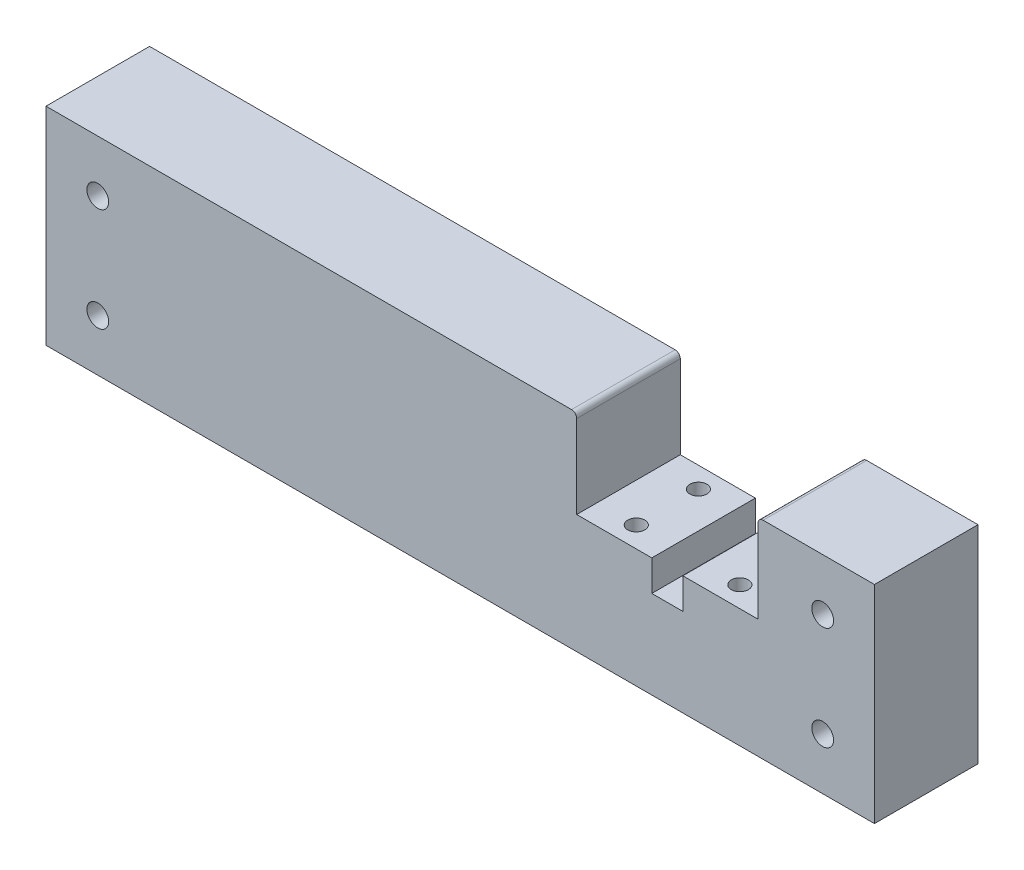
ISO-10303-21;
HEADER;
FILE_DESCRIPTION(('STEP AP214'),'2;1');
FILE_NAME('part.step','',(''),(''),'','','');
FILE_SCHEMA(('AUTOMOTIVE_DESIGN { 1 0 10303 214 1 1 1 1 }'));
ENDSEC;
DATA;
#1=APPLICATION_CONTEXT('core data for automotive mechanical design processes');
#2=APPLICATION_PROTOCOL_DEFINITION('international standard','automotive_design',2000,#1);
#3=PRODUCT_CONTEXT('',#1,'mechanical');
#4=PRODUCT('Part','Part','',(#3));
#5=PRODUCT_RELATED_PRODUCT_CATEGORY('part','',(#4));
#6=PRODUCT_DEFINITION_FORMATION('','',#4);
#7=PRODUCT_DEFINITION_CONTEXT('part definition',#1,'design');
#8=PRODUCT_DEFINITION('design','',#6,#7);
#9=PRODUCT_DEFINITION_SHAPE('','',#8);
#10=(LENGTH_UNIT() NAMED_UNIT(*) SI_UNIT(.MILLI.,.METRE.));
#11=(NAMED_UNIT(*) PLANE_ANGLE_UNIT() SI_UNIT($,.RADIAN.));
#12=(NAMED_UNIT(*) SI_UNIT($,.STERADIAN.) SOLID_ANGLE_UNIT());
#13=UNCERTAINTY_MEASURE_WITH_UNIT(LENGTH_MEASURE(1.E-05),#10,'distance_accuracy_value','');
#14=(GEOMETRIC_REPRESENTATION_CONTEXT(3) GLOBAL_UNCERTAINTY_ASSIGNED_CONTEXT((#13)) GLOBAL_UNIT_ASSIGNED_CONTEXT((#10,
#11,#12)) REPRESENTATION_CONTEXT('',''));
#15=CARTESIAN_POINT('',(0.,0.,0.));
#16=DIRECTION('',(0.,0.,1.));
#17=DIRECTION('',(1.,0.,0.));
#18=AXIS2_PLACEMENT_3D('',#15,#16,#17);
#19=CARTESIAN_POINT('',(57.5,0.,-20.));
#20=DIRECTION('',(1.,0.,0.));
#21=DIRECTION('',(0.,0.,-1.));
#22=AXIS2_PLACEMENT_3D('',#19,#20,#21);
#23=PLANE('',#22);
#24=DIRECTION('',(0.,1.,0.));
#25=VECTOR('',#24,1.);
#26=CARTESIAN_POINT('',(57.5,0.,0.));
#27=LINE('',#26,#25);
#28=CARTESIAN_POINT('',(57.5,22.95,0.));
#29=VERTEX_POINT('',#28);
#30=CARTESIAN_POINT('',(57.5,39.,0.));
#31=VERTEX_POINT('',#30);
#32=EDGE_CURVE('E236',#29,#31,#27,.T.);
#33=ORIENTED_EDGE('',*,*,#32,.T.);
#34=DIRECTION('',(0.,0.,1.));
#35=VECTOR('',#34,1.);
#36=CARTESIAN_POINT('',(57.5,39.,-20.));
#37=LINE('',#36,#35);
#38=CARTESIAN_POINT('',(57.5,39.,-20.));
#39=VERTEX_POINT('',#38);
#40=EDGE_CURVE('E323',#31,#39,#37,.F.);
#41=ORIENTED_EDGE('',*,*,#40,.T.);
#42=DIRECTION('',(0.,1.,0.));
#43=VECTOR('',#42,1.);
#44=CARTESIAN_POINT('',(57.5,0.,-20.));
#45=LINE('',#44,#43);
#46=CARTESIAN_POINT('',(57.5,22.95,-20.));
#47=VERTEX_POINT('',#46);
#48=EDGE_CURVE('E237',#47,#39,#45,.T.);
#49=ORIENTED_EDGE('',*,*,#48,.F.);
#50=DIRECTION('',(0.,0.,1.));
#51=VECTOR('',#50,1.);
#52=CARTESIAN_POINT('',(57.5,22.95,-20.));
#53=LINE('',#52,#51);
#54=EDGE_CURVE('E314',#47,#29,#53,.T.);
#55=ORIENTED_EDGE('',*,*,#54,.T.);
#56=EDGE_LOOP('',(#33,#41,#49,#55));
#57=FACE_BOUND('',#56,.T.);
#58=ADVANCED_FACE('F41',(#57),#23,.F.);
#59=CARTESIAN_POINT('',(0.,40.,-20.));
#60=DIRECTION('',(0.,-1.,0.));
#61=DIRECTION('',(0.,0.,-1.));
#62=AXIS2_PLACEMENT_3D('',#59,#60,#61);
#63=PLANE('',#62);
#64=DIRECTION('',(1.,0.,0.));
#65=VECTOR('',#64,1.);
#66=CARTESIAN_POINT('',(0.,40.,-20.));
#67=LINE('',#66,#65);
#68=CARTESIAN_POINT('',(58.5,40.,-20.));
#69=VERTEX_POINT('',#68);
#70=CARTESIAN_POINT('',(80.,40.,-20.));
#71=VERTEX_POINT('',#70);
#72=EDGE_CURVE('E256',#69,#71,#67,.T.);
#73=ORIENTED_EDGE('',*,*,#72,.F.);
#74=DIRECTION('',(0.,0.,1.));
#75=VECTOR('',#74,1.);
#76=CARTESIAN_POINT('',(58.5,40.,-20.));
#77=LINE('',#76,#75);
#78=CARTESIAN_POINT('',(58.5,40.,0.));
#79=VERTEX_POINT('',#78);
#80=EDGE_CURVE('E292',#69,#79,#77,.T.);
#81=ORIENTED_EDGE('',*,*,#80,.T.);
#82=DIRECTION('',(1.,0.,0.));
#83=VECTOR('',#82,1.);
#84=CARTESIAN_POINT('',(0.,40.,0.));
#85=LINE('',#84,#83);
#86=CARTESIAN_POINT('',(80.,40.,0.));
#87=VERTEX_POINT('',#86);
#88=EDGE_CURVE('E241',#79,#87,#85,.T.);
#89=ORIENTED_EDGE('',*,*,#88,.T.);
#90=DIRECTION('',(0.,0.,1.));
#91=VECTOR('',#90,1.);
#92=CARTESIAN_POINT('',(80.,40.,-20.));
#93=LINE('',#92,#91);
#94=EDGE_CURVE('E289',#71,#87,#93,.T.);
#95=ORIENTED_EDGE('',*,*,#94,.F.);
#96=EDGE_LOOP('',(#73,#81,#89,#95));
#97=FACE_BOUND('',#96,.T.);
#98=ADVANCED_FACE('F373',(#97),#63,.F.);
#99=CARTESIAN_POINT('',(80.,0.,-20.));
#100=DIRECTION('',(-1.,0.,0.));
#101=DIRECTION('',(0.,0.,1.));
#102=AXIS2_PLACEMENT_3D('',#99,#100,#101);
#103=PLANE('',#102);
#104=DIRECTION('',(0.,-1.,0.));
#105=VECTOR('',#104,1.);
#106=CARTESIAN_POINT('',(80.,0.,0.));
#107=LINE('',#106,#105);
#108=CARTESIAN_POINT('',(80.,0.,0.));
#109=VERTEX_POINT('',#108);
#110=EDGE_CURVE('E286',#87,#109,#107,.T.);
#111=ORIENTED_EDGE('',*,*,#110,.T.);
#112=DIRECTION('',(0.,0.,1.));
#113=VECTOR('',#112,1.);
#114=CARTESIAN_POINT('',(80.,0.,-20.));
#115=LINE('',#114,#113);
#116=CARTESIAN_POINT('',(80.,0.,-20.));
#117=VERTEX_POINT('',#116);
#118=EDGE_CURVE('E293',#117,#109,#115,.T.);
#119=ORIENTED_EDGE('',*,*,#118,.F.);
#120=DIRECTION('',(0.,-1.,0.));
#121=VECTOR('',#120,1.);
#122=CARTESIAN_POINT('',(80.,0.,-20.));
#123=LINE('',#122,#121);
#124=EDGE_CURVE('E262',#71,#117,#123,.T.);
#125=ORIENTED_EDGE('',*,*,#124,.F.);
#126=ORIENTED_EDGE('',*,*,#94,.T.);
#127=EDGE_LOOP('',(#111,#119,#125,#126));
#128=FACE_BOUND('',#127,.T.);
#129=ADVANCED_FACE('F380',(#128),#103,.F.);
#130=CARTESIAN_POINT('',(0.,0.,-20.));
#131=DIRECTION('',(0.,-1.,0.));
#132=DIRECTION('',(1.,0.,0.));
#133=AXIS2_PLACEMENT_3D('',#130,#131,#132);
#134=PLANE('',#133);
#135=CARTESIAN_POINT('',(-60.,0.,-10.));
#136=DIRECTION('',(0.,-1.,0.));
#137=DIRECTION('',(0.,0.,-1.));
#138=AXIS2_PLACEMENT_3D('',#135,#136,#137);
#139=CIRCLE('',#138,2.09999999999999);
#140=CARTESIAN_POINT('',(-60.,0.,-12.1));
#141=VERTEX_POINT('',#140);
#142=EDGE_CURVE('E172',#141,#141,#139,.T.);
#143=ORIENTED_EDGE('',*,*,#142,.F.);
#144=EDGE_LOOP('',(#143));
#145=FACE_BOUND('',#144,.T.);
#146=CARTESIAN_POINT('',(0.,0.,-10.));
#147=DIRECTION('',(0.,-1.,0.));
#148=DIRECTION('',(0.,0.,-1.));
#149=AXIS2_PLACEMENT_3D('',#146,#147,#148);
#150=CIRCLE('',#149,2.09999999999999);
#151=CARTESIAN_POINT('',(0.,0.,-12.1));
#152=VERTEX_POINT('',#151);
#153=EDGE_CURVE('E171',#152,#152,#150,.T.);
#154=ORIENTED_EDGE('',*,*,#153,.F.);
#155=EDGE_LOOP('',(#154));
#156=FACE_BOUND('',#155,.T.);
#157=CARTESIAN_POINT('',(60.,0.,-10.));
#158=DIRECTION('',(0.,-1.,0.));
#159=DIRECTION('',(0.,0.,-1.));
#160=AXIS2_PLACEMENT_3D('',#157,#158,#159);
#161=CIRCLE('',#160,2.09999999999999);
#162=CARTESIAN_POINT('',(60.,0.,-12.1));
#163=VERTEX_POINT('',#162);
#164=EDGE_CURVE('E182',#163,#163,#161,.T.);
#165=ORIENTED_EDGE('',*,*,#164,.F.);
#166=EDGE_LOOP('',(#165));
#167=FACE_BOUND('',#166,.T.);
#168=DIRECTION('',(1.,0.,0.));
#169=VECTOR('',#168,1.);
#170=CARTESIAN_POINT('',(0.,0.,0.));
#171=LINE('',#170,#169);
#172=CARTESIAN_POINT('',(-80.,0.,0.));
#173=VERTEX_POINT('',#172);
#174=EDGE_CURVE('E283',#173,#109,#171,.T.);
#175=ORIENTED_EDGE('',*,*,#174,.F.);
#176=DIRECTION('',(0.,0.,1.));
#177=VECTOR('',#176,1.);
#178=CARTESIAN_POINT('',(-80.,0.,-20.));
#179=LINE('',#178,#177);
#180=CARTESIAN_POINT('',(-80.,0.,-20.));
#181=VERTEX_POINT('',#180);
#182=EDGE_CURVE('E295',#181,#173,#179,.T.);
#183=ORIENTED_EDGE('',*,*,#182,.F.);
#184=DIRECTION('',(1.,0.,0.));
#185=VECTOR('',#184,1.);
#186=CARTESIAN_POINT('',(0.,0.,-20.));
#187=LINE('',#186,#185);
#188=EDGE_CURVE('E259',#181,#117,#187,.T.);
#189=ORIENTED_EDGE('',*,*,#188,.T.);
#190=ORIENTED_EDGE('',*,*,#118,.T.);
#191=EDGE_LOOP('',(#175,#183,#189,#190));
#192=FACE_BOUND('',#191,.T.);
#193=ADVANCED_FACE('F416',(#145,#156,#167,#192),#134,.T.);
#194=CARTESIAN_POINT('',(-80.,0.,-20.));
#195=DIRECTION('',(-1.,0.,0.));
#196=DIRECTION('',(0.,0.,1.));
#197=AXIS2_PLACEMENT_3D('',#194,#195,#196);
#198=PLANE('',#197);
#199=DIRECTION('',(0.,-1.,0.));
#200=VECTOR('',#199,1.);
#201=CARTESIAN_POINT('',(-80.,0.,0.));
#202=LINE('',#201,#200);
#203=CARTESIAN_POINT('',(-80.,40.,0.));
#204=VERTEX_POINT('',#203);
#205=EDGE_CURVE('E280',#204,#173,#202,.T.);
#206=ORIENTED_EDGE('',*,*,#205,.F.);
#207=DIRECTION('',(0.,0.,1.));
#208=VECTOR('',#207,1.);
#209=CARTESIAN_POINT('',(-80.,40.,-20.));
#210=LINE('',#209,#208);
#211=CARTESIAN_POINT('',(-80.,40.,-20.));
#212=VERTEX_POINT('',#211);
#213=EDGE_CURVE('E297',#212,#204,#210,.T.);
#214=ORIENTED_EDGE('',*,*,#213,.F.);
#215=DIRECTION('',(0.,-1.,0.));
#216=VECTOR('',#215,1.);
#217=CARTESIAN_POINT('',(-80.,0.,-20.));
#218=LINE('',#217,#216);
#219=EDGE_CURVE('E255',#212,#181,#218,.T.);
#220=ORIENTED_EDGE('',*,*,#219,.T.);
#221=ORIENTED_EDGE('',*,*,#182,.T.);
#222=EDGE_LOOP('',(#206,#214,#220,#221));
#223=FACE_BOUND('',#222,.T.);
#224=ADVANCED_FACE('F387',(#223),#198,.T.);
#225=CARTESIAN_POINT('',(21.5,40.,0.));
#226=VERTEX_POINT('',#225);
#227=EDGE_CURVE('E278',#204,#226,#85,.T.);
#228=ORIENTED_EDGE('',*,*,#227,.T.);
#229=DIRECTION('',(0.,0.,1.));
#230=VECTOR('',#229,1.);
#231=CARTESIAN_POINT('',(21.5,40.,-20.));
#232=LINE('',#231,#230);
#233=CARTESIAN_POINT('',(21.5,40.,-20.));
#234=VERTEX_POINT('',#233);
#235=EDGE_CURVE('E11',#226,#234,#232,.F.);
#236=ORIENTED_EDGE('',*,*,#235,.T.);
#237=EDGE_CURVE('E253',#212,#234,#67,.T.);
#238=ORIENTED_EDGE('',*,*,#237,.F.);
#239=ORIENTED_EDGE('',*,*,#213,.T.);
#240=EDGE_LOOP('',(#228,#236,#238,#239));
#241=FACE_BOUND('',#240,.T.);
#242=ADVANCED_FACE('F388',(#241),#63,.F.);
#243=CARTESIAN_POINT('',(22.5,0.,-20.));
#244=DIRECTION('',(-1.,0.,0.));
#245=DIRECTION('',(0.,0.,1.));
#246=AXIS2_PLACEMENT_3D('',#243,#244,#245);
#247=PLANE('',#246);
#248=DIRECTION('',(0.,-1.,0.));
#249=VECTOR('',#248,1.);
#250=CARTESIAN_POINT('',(22.5,0.,-20.));
#251=LINE('',#250,#249);
#252=CARTESIAN_POINT('',(22.5,39.,-20.));
#253=VERTEX_POINT('',#252);
#254=CARTESIAN_POINT('',(22.5,22.95,-20.));
#255=VERTEX_POINT('',#254);
#256=EDGE_CURVE('E251',#253,#255,#251,.T.);
#257=ORIENTED_EDGE('',*,*,#256,.F.);
#258=DIRECTION('',(0.,0.,1.));
#259=VECTOR('',#258,1.);
#260=CARTESIAN_POINT('',(22.5,39.,-20.));
#261=LINE('',#260,#259);
#262=CARTESIAN_POINT('',(22.5,39.,0.));
#263=VERTEX_POINT('',#262);
#264=EDGE_CURVE('E49',#253,#263,#261,.T.);
#265=ORIENTED_EDGE('',*,*,#264,.T.);
#266=DIRECTION('',(0.,-1.,0.));
#267=VECTOR('',#266,1.);
#268=CARTESIAN_POINT('',(22.5,0.,0.));
#269=LINE('',#268,#267);
#270=CARTESIAN_POINT('',(22.5,22.95,0.));
#271=VERTEX_POINT('',#270);
#272=EDGE_CURVE('E276',#263,#271,#269,.T.);
#273=ORIENTED_EDGE('',*,*,#272,.T.);
#274=DIRECTION('',(0.,0.,1.));
#275=VECTOR('',#274,1.);
#276=CARTESIAN_POINT('',(22.5,22.95,-20.));
#277=LINE('',#276,#275);
#278=EDGE_CURVE('E299',#255,#271,#277,.T.);
#279=ORIENTED_EDGE('',*,*,#278,.F.);
#280=EDGE_LOOP('',(#257,#265,#273,#279));
#281=FACE_BOUND('',#280,.T.);
#282=ADVANCED_FACE('F331',(#281),#247,.F.);
#283=CARTESIAN_POINT('',(0.,22.95,-20.));
#284=DIRECTION('',(0.,-1.,0.));
#285=DIRECTION('',(0.,0.,-1.));
#286=AXIS2_PLACEMENT_3D('',#283,#284,#285);
#287=PLANE('',#286);
#288=CARTESIAN_POINT('',(30.,22.95,-4.));
#289=DIRECTION('',(0.,1.,0.));
#290=DIRECTION('',(0.,0.,1.));
#291=AXIS2_PLACEMENT_3D('',#288,#289,#290);
#292=CIRCLE('',#291,1.64999999999999);
#293=CARTESIAN_POINT('',(30.,22.95,-2.35000000000001));
#294=VERTEX_POINT('',#293);
#295=EDGE_CURVE('E212',#294,#294,#292,.T.);
#296=ORIENTED_EDGE('',*,*,#295,.F.);
#297=EDGE_LOOP('',(#296));
#298=FACE_BOUND('',#297,.T.);
#299=CARTESIAN_POINT('',(30.,22.95,-16.));
#300=DIRECTION('',(0.,1.,0.));
#301=DIRECTION('',(0.,0.,1.));
#302=AXIS2_PLACEMENT_3D('',#299,#300,#301);
#303=CIRCLE('',#302,1.64999999999999);
#304=CARTESIAN_POINT('',(30.,22.95,-14.35));
#305=VERTEX_POINT('',#304);
#306=EDGE_CURVE('E224',#305,#305,#303,.T.);
#307=ORIENTED_EDGE('',*,*,#306,.F.);
#308=EDGE_LOOP('',(#307));
#309=FACE_BOUND('',#308,.T.);
#310=DIRECTION('',(1.,0.,0.));
#311=VECTOR('',#310,1.);
#312=CARTESIAN_POINT('',(0.,22.95,0.));
#313=LINE('',#312,#311);
#314=CARTESIAN_POINT('',(37.,22.95,0.));
#315=VERTEX_POINT('',#314);
#316=EDGE_CURVE('E274',#271,#315,#313,.T.);
#317=ORIENTED_EDGE('',*,*,#316,.T.);
#318=DIRECTION('',(0.,0.,1.));
#319=VECTOR('',#318,1.);
#320=CARTESIAN_POINT('',(37.,22.95,-20.));
#321=LINE('',#320,#319);
#322=CARTESIAN_POINT('',(37.,22.95,-20.));
#323=VERTEX_POINT('',#322);
#324=EDGE_CURVE('E302',#323,#315,#321,.T.);
#325=ORIENTED_EDGE('',*,*,#324,.F.);
#326=DIRECTION('',(1.,0.,0.));
#327=VECTOR('',#326,1.);
#328=CARTESIAN_POINT('',(0.,22.95,-20.));
#329=LINE('',#328,#327);
#330=EDGE_CURVE('E249',#255,#323,#329,.T.);
#331=ORIENTED_EDGE('',*,*,#330,.F.);
#332=ORIENTED_EDGE('',*,*,#278,.T.);
#333=EDGE_LOOP('',(#317,#325,#331,#332));
#334=FACE_BOUND('',#333,.T.);
#335=ADVANCED_FACE('F343',(#298,#309,#334),#287,.F.);
#336=CARTESIAN_POINT('',(37.,0.,-20.));
#337=DIRECTION('',(-1.,0.,0.));
#338=DIRECTION('',(0.,0.,1.));
#339=AXIS2_PLACEMENT_3D('',#336,#337,#338);
#340=PLANE('',#339);
#341=DIRECTION('',(0.,-1.,0.));
#342=VECTOR('',#341,1.);
#343=CARTESIAN_POINT('',(37.,0.,0.));
#344=LINE('',#343,#342);
#345=CARTESIAN_POINT('',(37.,17.,0.));
#346=VERTEX_POINT('',#345);
#347=EDGE_CURVE('E272',#315,#346,#344,.T.);
#348=ORIENTED_EDGE('',*,*,#347,.T.);
#349=DIRECTION('',(0.,0.,1.));
#350=VECTOR('',#349,1.);
#351=CARTESIAN_POINT('',(37.,17.,-20.));
#352=LINE('',#351,#350);
#353=CARTESIAN_POINT('',(37.,17.,-20.));
#354=VERTEX_POINT('',#353);
#355=EDGE_CURVE('E305',#354,#346,#352,.T.);
#356=ORIENTED_EDGE('',*,*,#355,.F.);
#357=DIRECTION('',(0.,-1.,0.));
#358=VECTOR('',#357,1.);
#359=CARTESIAN_POINT('',(37.,0.,-20.));
#360=LINE('',#359,#358);
#361=EDGE_CURVE('E247',#323,#354,#360,.T.);
#362=ORIENTED_EDGE('',*,*,#361,.F.);
#363=ORIENTED_EDGE('',*,*,#324,.T.);
#364=EDGE_LOOP('',(#348,#356,#362,#363));
#365=FACE_BOUND('',#364,.T.);
#366=ADVANCED_FACE('F347',(#365),#340,.F.);
#367=CARTESIAN_POINT('',(0.,17.,-20.));
#368=DIRECTION('',(0.,-1.,0.));
#369=DIRECTION('',(0.,0.,-1.));
#370=AXIS2_PLACEMENT_3D('',#367,#368,#369);
#371=PLANE('',#370);
#372=DIRECTION('',(1.,0.,0.));
#373=VECTOR('',#372,1.);
#374=CARTESIAN_POINT('',(0.,17.,0.));
#375=LINE('',#374,#373);
#376=CARTESIAN_POINT('',(43.,17.,0.));
#377=VERTEX_POINT('',#376);
#378=EDGE_CURVE('E270',#346,#377,#375,.T.);
#379=ORIENTED_EDGE('',*,*,#378,.T.);
#380=DIRECTION('',(0.,0.,1.));
#381=VECTOR('',#380,1.);
#382=CARTESIAN_POINT('',(43.,17.,-20.));
#383=LINE('',#382,#381);
#384=CARTESIAN_POINT('',(43.,17.,-20.));
#385=VERTEX_POINT('',#384);
#386=EDGE_CURVE('E308',#385,#377,#383,.T.);
#387=ORIENTED_EDGE('',*,*,#386,.F.);
#388=DIRECTION('',(1.,0.,0.));
#389=VECTOR('',#388,1.);
#390=CARTESIAN_POINT('',(0.,17.,-20.));
#391=LINE('',#390,#389);
#392=EDGE_CURVE('E245',#354,#385,#391,.T.);
#393=ORIENTED_EDGE('',*,*,#392,.F.);
#394=ORIENTED_EDGE('',*,*,#355,.T.);
#395=EDGE_LOOP('',(#379,#387,#393,#394));
#396=FACE_BOUND('',#395,.T.);
#397=ADVANCED_FACE('F355',(#396),#371,.F.);
#398=CARTESIAN_POINT('',(43.,0.,-20.));
#399=DIRECTION('',(1.,0.,0.));
#400=DIRECTION('',(0.,0.,-1.));
#401=AXIS2_PLACEMENT_3D('',#398,#399,#400);
#402=PLANE('',#401);
#403=DIRECTION('',(0.,1.,0.));
#404=VECTOR('',#403,1.);
#405=CARTESIAN_POINT('',(43.,0.,0.));
#406=LINE('',#405,#404);
#407=CARTESIAN_POINT('',(43.,22.95,0.));
#408=VERTEX_POINT('',#407);
#409=EDGE_CURVE('E268',#377,#408,#406,.T.);
#410=ORIENTED_EDGE('',*,*,#409,.T.);
#411=DIRECTION('',(0.,0.,1.));
#412=VECTOR('',#411,1.);
#413=CARTESIAN_POINT('',(43.,22.95,-20.));
#414=LINE('',#413,#412);
#415=CARTESIAN_POINT('',(43.,22.95,-20.));
#416=VERTEX_POINT('',#415);
#417=EDGE_CURVE('E311',#416,#408,#414,.T.);
#418=ORIENTED_EDGE('',*,*,#417,.F.);
#419=DIRECTION('',(0.,1.,0.));
#420=VECTOR('',#419,1.);
#421=CARTESIAN_POINT('',(43.,0.,-20.));
#422=LINE('',#421,#420);
#423=EDGE_CURVE('E243',#385,#416,#422,.T.);
#424=ORIENTED_EDGE('',*,*,#423,.F.);
#425=ORIENTED_EDGE('',*,*,#386,.T.);
#426=EDGE_LOOP('',(#410,#418,#424,#425));
#427=FACE_BOUND('',#426,.T.);
#428=ADVANCED_FACE('F358',(#427),#402,.F.);
#429=CARTESIAN_POINT('',(0.,22.95,-20.));
#430=DIRECTION('',(0.,-1.,0.));
#431=DIRECTION('',(0.,0.,-1.));
#432=AXIS2_PLACEMENT_3D('',#429,#430,#431);
#433=PLANE('',#432);
#434=CARTESIAN_POINT('',(50.,22.95,-4.));
#435=DIRECTION('',(0.,1.,0.));
#436=DIRECTION('',(0.,0.,1.));
#437=AXIS2_PLACEMENT_3D('',#434,#435,#436);
#438=CIRCLE('',#437,1.64999999999999);
#439=CARTESIAN_POINT('',(50.,22.95,-2.35000000000001));
#440=VERTEX_POINT('',#439);
#441=EDGE_CURVE('E218',#440,#440,#438,.T.);
#442=ORIENTED_EDGE('',*,*,#441,.F.);
#443=EDGE_LOOP('',(#442));
#444=FACE_BOUND('',#443,.T.);
#445=CARTESIAN_POINT('',(50.,22.95,-16.));
#446=DIRECTION('',(0.,1.,0.));
#447=DIRECTION('',(0.,0.,1.));
#448=AXIS2_PLACEMENT_3D('',#445,#446,#447);
#449=CIRCLE('',#448,1.64999999999999);
#450=CARTESIAN_POINT('',(50.,22.95,-14.35));
#451=VERTEX_POINT('',#450);
#452=EDGE_CURVE('E230',#451,#451,#449,.T.);
#453=ORIENTED_EDGE('',*,*,#452,.F.);
#454=EDGE_LOOP('',(#453));
#455=FACE_BOUND('',#454,.T.);
#456=DIRECTION('',(1.,0.,0.));
#457=VECTOR('',#456,1.);
#458=CARTESIAN_POINT('',(0.,22.95,0.));
#459=LINE('',#458,#457);
#460=EDGE_CURVE('E266',#408,#29,#459,.T.);
#461=ORIENTED_EDGE('',*,*,#460,.T.);
#462=ORIENTED_EDGE('',*,*,#54,.F.);
#463=DIRECTION('',(1.,0.,0.));
#464=VECTOR('',#463,1.);
#465=CARTESIAN_POINT('',(0.,22.95,-20.));
#466=LINE('',#465,#464);
#467=EDGE_CURVE('E240',#416,#47,#466,.T.);
#468=ORIENTED_EDGE('',*,*,#467,.F.);
#469=ORIENTED_EDGE('',*,*,#417,.T.);
#470=EDGE_LOOP('',(#461,#462,#468,#469));
#471=FACE_BOUND('',#470,.T.);
#472=ADVANCED_FACE('F363',(#444,#455,#471),#433,.F.);
#473=CARTESIAN_POINT('',(0.,0.,-20.));
#474=DIRECTION('',(0.,0.,1.));
#475=DIRECTION('',(1.,0.,0.));
#476=AXIS2_PLACEMENT_3D('',#473,#474,#475);
#477=PLANE('',#476);
#478=CARTESIAN_POINT('',(-70.,30.,-20.));
#479=DIRECTION('',(0.,0.,1.));
#480=DIRECTION('',(1.,0.,0.));
#481=AXIS2_PLACEMENT_3D('',#478,#479,#480);
#482=CIRCLE('',#481,2.09999999999999);
#483=CARTESIAN_POINT('',(-67.9,30.,-20.));
#484=VERTEX_POINT('',#483);
#485=EDGE_CURVE('E191',#484,#484,#482,.T.);
#486=ORIENTED_EDGE('',*,*,#485,.T.);
#487=EDGE_LOOP('',(#486));
#488=FACE_BOUND('',#487,.T.);
#489=CARTESIAN_POINT('',(-70.,10.,-20.));
#490=DIRECTION('',(0.,0.,1.));
#491=DIRECTION('',(1.,0.,0.));
#492=AXIS2_PLACEMENT_3D('',#489,#490,#491);
#493=CIRCLE('',#492,2.09999999999999);
#494=CARTESIAN_POINT('',(-67.9,10.,-20.));
#495=VERTEX_POINT('',#494);
#496=EDGE_CURVE('E197',#495,#495,#493,.T.);
#497=ORIENTED_EDGE('',*,*,#496,.T.);
#498=EDGE_LOOP('',(#497));
#499=FACE_BOUND('',#498,.T.);
#500=CARTESIAN_POINT('',(70.,10.,-20.));
#501=DIRECTION('',(0.,0.,1.));
#502=DIRECTION('',(1.,0.,0.));
#503=AXIS2_PLACEMENT_3D('',#500,#501,#502);
#504=CIRCLE('',#503,2.09999999999999);
#505=CARTESIAN_POINT('',(72.1,10.,-20.));
#506=VERTEX_POINT('',#505);
#507=EDGE_CURVE('E203',#506,#506,#504,.T.);
#508=ORIENTED_EDGE('',*,*,#507,.T.);
#509=EDGE_LOOP('',(#508));
#510=FACE_BOUND('',#509,.T.);
#511=CARTESIAN_POINT('',(70.,30.,-20.));
#512=DIRECTION('',(0.,0.,1.));
#513=DIRECTION('',(1.,0.,0.));
#514=AXIS2_PLACEMENT_3D('',#511,#512,#513);
#515=CIRCLE('',#514,2.09999999999999);
#516=CARTESIAN_POINT('',(72.1,30.,-20.));
#517=VERTEX_POINT('',#516);
#518=EDGE_CURVE('E209',#517,#517,#515,.T.);
#519=ORIENTED_EDGE('',*,*,#518,.T.);
#520=EDGE_LOOP('',(#519));
#521=FACE_BOUND('',#520,.T.);
#522=ORIENTED_EDGE('',*,*,#48,.T.);
#523=CARTESIAN_POINT('',(58.5,39.,-20.));
#524=DIRECTION('',(0.,0.,1.));
#525=DIRECTION('',(1.,0.,0.));
#526=AXIS2_PLACEMENT_3D('',#523,#524,#525);
#527=CIRCLE('',#526,1.);
#528=EDGE_CURVE('E326',#39,#69,#527,.F.);
#529=ORIENTED_EDGE('',*,*,#528,.T.);
#530=ORIENTED_EDGE('',*,*,#72,.T.);
#531=ORIENTED_EDGE('',*,*,#124,.T.);
#532=ORIENTED_EDGE('',*,*,#188,.F.);
#533=ORIENTED_EDGE('',*,*,#219,.F.);
#534=ORIENTED_EDGE('',*,*,#237,.T.);
#535=CARTESIAN_POINT('',(21.5,39.,-20.));
#536=DIRECTION('',(0.,0.,1.));
#537=DIRECTION('',(1.,0.,0.));
#538=AXIS2_PLACEMENT_3D('',#535,#536,#537);
#539=CIRCLE('',#538,1.);
#540=EDGE_CURVE('E56',#234,#253,#539,.F.);
#541=ORIENTED_EDGE('',*,*,#540,.T.);
#542=ORIENTED_EDGE('',*,*,#256,.T.);
#543=ORIENTED_EDGE('',*,*,#330,.T.);
#544=ORIENTED_EDGE('',*,*,#361,.T.);
#545=ORIENTED_EDGE('',*,*,#392,.T.);
#546=ORIENTED_EDGE('',*,*,#423,.T.);
#547=ORIENTED_EDGE('',*,*,#467,.T.);
#548=EDGE_LOOP('',(#522,#529,#530,#531,#532,#533,#534,#541,#542,#543,#544,#545,#546,#547));
#549=FACE_BOUND('',#548,.T.);
#550=ADVANCED_FACE('F350',(#488,#499,#510,#521,#549),#477,.F.);
#551=CARTESIAN_POINT('',(0.,0.,0.));
#552=DIRECTION('',(0.,0.,1.));
#553=DIRECTION('',(1.,0.,0.));
#554=AXIS2_PLACEMENT_3D('',#551,#552,#553);
#555=PLANE('',#554);
#556=CARTESIAN_POINT('',(-70.,30.,0.));
#557=DIRECTION('',(0.,0.,1.));
#558=DIRECTION('',(1.,0.,0.));
#559=AXIS2_PLACEMENT_3D('',#556,#557,#558);
#560=CIRCLE('',#559,2.09999999999999);
#561=CARTESIAN_POINT('',(-67.9,30.,0.));
#562=VERTEX_POINT('',#561);
#563=EDGE_CURVE('E188',#562,#562,#560,.T.);
#564=ORIENTED_EDGE('',*,*,#563,.F.);
#565=EDGE_LOOP('',(#564));
#566=FACE_BOUND('',#565,.T.);
#567=CARTESIAN_POINT('',(-70.,10.,0.));
#568=DIRECTION('',(0.,0.,1.));
#569=DIRECTION('',(1.,0.,0.));
#570=AXIS2_PLACEMENT_3D('',#567,#568,#569);
#571=CIRCLE('',#570,2.09999999999999);
#572=CARTESIAN_POINT('',(-67.9,10.,0.));
#573=VERTEX_POINT('',#572);
#574=EDGE_CURVE('E194',#573,#573,#571,.T.);
#575=ORIENTED_EDGE('',*,*,#574,.F.);
#576=EDGE_LOOP('',(#575));
#577=FACE_BOUND('',#576,.T.);
#578=CARTESIAN_POINT('',(70.,10.,0.));
#579=DIRECTION('',(0.,0.,1.));
#580=DIRECTION('',(1.,0.,0.));
#581=AXIS2_PLACEMENT_3D('',#578,#579,#580);
#582=CIRCLE('',#581,2.09999999999999);
#583=CARTESIAN_POINT('',(72.1,10.,0.));
#584=VERTEX_POINT('',#583);
#585=EDGE_CURVE('E200',#584,#584,#582,.T.);
#586=ORIENTED_EDGE('',*,*,#585,.F.);
#587=EDGE_LOOP('',(#586));
#588=FACE_BOUND('',#587,.T.);
#589=CARTESIAN_POINT('',(70.,30.,0.));
#590=DIRECTION('',(0.,0.,1.));
#591=DIRECTION('',(1.,0.,0.));
#592=AXIS2_PLACEMENT_3D('',#589,#590,#591);
#593=CIRCLE('',#592,2.09999999999999);
#594=CARTESIAN_POINT('',(72.1,30.,0.));
#595=VERTEX_POINT('',#594);
#596=EDGE_CURVE('E206',#595,#595,#593,.T.);
#597=ORIENTED_EDGE('',*,*,#596,.F.);
#598=EDGE_LOOP('',(#597));
#599=FACE_BOUND('',#598,.T.);
#600=ORIENTED_EDGE('',*,*,#88,.F.);
#601=CARTESIAN_POINT('',(58.5,39.,0.));
#602=DIRECTION('',(0.,0.,1.));
#603=DIRECTION('',(1.,0.,0.));
#604=AXIS2_PLACEMENT_3D('',#601,#602,#603);
#605=CIRCLE('',#604,1.);
#606=EDGE_CURVE('E321',#79,#31,#605,.T.);
#607=ORIENTED_EDGE('',*,*,#606,.T.);
#608=ORIENTED_EDGE('',*,*,#32,.F.);
#609=ORIENTED_EDGE('',*,*,#460,.F.);
#610=ORIENTED_EDGE('',*,*,#409,.F.);
#611=ORIENTED_EDGE('',*,*,#378,.F.);
#612=ORIENTED_EDGE('',*,*,#347,.F.);
#613=ORIENTED_EDGE('',*,*,#316,.F.);
#614=ORIENTED_EDGE('',*,*,#272,.F.);
#615=CARTESIAN_POINT('',(21.5,39.,0.));
#616=DIRECTION('',(0.,0.,1.));
#617=DIRECTION('',(1.,0.,0.));
#618=AXIS2_PLACEMENT_3D('',#615,#616,#617);
#619=CIRCLE('',#618,1.);
#620=EDGE_CURVE('E319',#263,#226,#619,.T.);
#621=ORIENTED_EDGE('',*,*,#620,.T.);
#622=ORIENTED_EDGE('',*,*,#227,.F.);
#623=ORIENTED_EDGE('',*,*,#205,.T.);
#624=ORIENTED_EDGE('',*,*,#174,.T.);
#625=ORIENTED_EDGE('',*,*,#110,.F.);
#626=EDGE_LOOP('',(#600,#607,#608,#609,#610,#611,#612,#613,#614,#621,#622,#623,#624,#625));
#627=FACE_BOUND('',#626,.T.);
#628=ADVANCED_FACE('F337',(#566,#577,#588,#599,#627),#555,.T.);
#629=CARTESIAN_POINT('',(50.,17.95,-16.));
#630=DIRECTION('',(0.,1.,0.));
#631=DIRECTION('',(0.,0.,1.));
#632=AXIS2_PLACEMENT_3D('',#629,#630,#631);
#633=CONICAL_SURFACE('',#632,1.65,1.02974425867665);
#634=CARTESIAN_POINT('',(50.,16.9585799786045,-16.));
#635=VERTEX_POINT('',#634);
#636=VERTEX_LOOP('',#635);
#637=FACE_BOUND('',#636,.T.);
#638=CARTESIAN_POINT('',(50.,17.95,-16.));
#639=DIRECTION('',(0.,1.,0.));
#640=DIRECTION('',(0.,0.,1.));
#641=AXIS2_PLACEMENT_3D('',#638,#639,#640);
#642=CIRCLE('',#641,1.65);
#643=CARTESIAN_POINT('',(50.,17.95,-14.35));
#644=VERTEX_POINT('',#643);
#645=EDGE_CURVE('E233',#644,#644,#642,.T.);
#646=ORIENTED_EDGE('',*,*,#645,.T.);
#647=EDGE_LOOP('',(#646));
#648=FACE_BOUND('',#647,.T.);
#649=ADVANCED_FACE('F424',(#637,#648),#633,.F.);
#650=CARTESIAN_POINT('',(50.,22.95,-16.));
#651=DIRECTION('',(0.,1.,0.));
#652=DIRECTION('',(0.,0.,1.));
#653=AXIS2_PLACEMENT_3D('',#650,#651,#652);
#654=CYLINDRICAL_SURFACE('',#653,1.65);
#655=ORIENTED_EDGE('',*,*,#645,.F.);
#656=EDGE_LOOP('',(#655));
#657=FACE_BOUND('',#656,.T.);
#658=ORIENTED_EDGE('',*,*,#452,.T.);
#659=EDGE_LOOP('',(#658));
#660=FACE_BOUND('',#659,.T.);
#661=ADVANCED_FACE('F431',(#657,#660),#654,.F.);
#662=CARTESIAN_POINT('',(30.,17.95,-16.));
#663=DIRECTION('',(0.,1.,0.));
#664=DIRECTION('',(0.,0.,1.));
#665=AXIS2_PLACEMENT_3D('',#662,#663,#664);
#666=CONICAL_SURFACE('',#665,1.65,1.02974425867665);
#667=CARTESIAN_POINT('',(30.,16.9585799786045,-16.));
#668=VERTEX_POINT('',#667);
#669=VERTEX_LOOP('',#668);
#670=FACE_BOUND('',#669,.T.);
#671=CARTESIAN_POINT('',(30.,17.95,-16.));
#672=DIRECTION('',(0.,1.,0.));
#673=DIRECTION('',(0.,0.,1.));
#674=AXIS2_PLACEMENT_3D('',#671,#672,#673);
#675=CIRCLE('',#674,1.65);
#676=CARTESIAN_POINT('',(30.,17.95,-14.35));
#677=VERTEX_POINT('',#676);
#678=EDGE_CURVE('E227',#677,#677,#675,.T.);
#679=ORIENTED_EDGE('',*,*,#678,.T.);
#680=EDGE_LOOP('',(#679));
#681=FACE_BOUND('',#680,.T.);
#682=ADVANCED_FACE('F435',(#670,#681),#666,.F.);
#683=CARTESIAN_POINT('',(30.,22.95,-16.));
#684=DIRECTION('',(0.,1.,0.));
#685=DIRECTION('',(0.,0.,1.));
#686=AXIS2_PLACEMENT_3D('',#683,#684,#685);
#687=CYLINDRICAL_SURFACE('',#686,1.65);
#688=ORIENTED_EDGE('',*,*,#678,.F.);
#689=EDGE_LOOP('',(#688));
#690=FACE_BOUND('',#689,.T.);
#691=ORIENTED_EDGE('',*,*,#306,.T.);
#692=EDGE_LOOP('',(#691));
#693=FACE_BOUND('',#692,.T.);
#694=ADVANCED_FACE('F439',(#690,#693),#687,.F.);
#695=CARTESIAN_POINT('',(50.,17.95,-4.));
#696=DIRECTION('',(0.,1.,0.));
#697=DIRECTION('',(0.,0.,1.));
#698=AXIS2_PLACEMENT_3D('',#695,#696,#697);
#699=CONICAL_SURFACE('',#698,1.65,1.02974425867665);
#700=CARTESIAN_POINT('',(50.,16.9585799786045,-4.));
#701=VERTEX_POINT('',#700);
#702=VERTEX_LOOP('',#701);
#703=FACE_BOUND('',#702,.T.);
#704=CARTESIAN_POINT('',(50.,17.95,-4.));
#705=DIRECTION('',(0.,1.,0.));
#706=DIRECTION('',(0.,0.,1.));
#707=AXIS2_PLACEMENT_3D('',#704,#705,#706);
#708=CIRCLE('',#707,1.65);
#709=CARTESIAN_POINT('',(50.,17.95,-2.35));
#710=VERTEX_POINT('',#709);
#711=EDGE_CURVE('E221',#710,#710,#708,.T.);
#712=ORIENTED_EDGE('',*,*,#711,.T.);
#713=EDGE_LOOP('',(#712));
#714=FACE_BOUND('',#713,.T.);
#715=ADVANCED_FACE('F443',(#703,#714),#699,.F.);
#716=CARTESIAN_POINT('',(50.,22.95,-4.));
#717=DIRECTION('',(0.,1.,0.));
#718=DIRECTION('',(0.,0.,1.));
#719=AXIS2_PLACEMENT_3D('',#716,#717,#718);
#720=CYLINDRICAL_SURFACE('',#719,1.65);
#721=ORIENTED_EDGE('',*,*,#711,.F.);
#722=EDGE_LOOP('',(#721));
#723=FACE_BOUND('',#722,.T.);
#724=ORIENTED_EDGE('',*,*,#441,.T.);
#725=EDGE_LOOP('',(#724));
#726=FACE_BOUND('',#725,.T.);
#727=ADVANCED_FACE('F447',(#723,#726),#720,.F.);
#728=CARTESIAN_POINT('',(30.,17.95,-4.));
#729=DIRECTION('',(0.,1.,0.));
#730=DIRECTION('',(0.,0.,1.));
#731=AXIS2_PLACEMENT_3D('',#728,#729,#730);
#732=CONICAL_SURFACE('',#731,1.65,1.02974425867665);
#733=CARTESIAN_POINT('',(30.,16.9585799786045,-4.));
#734=VERTEX_POINT('',#733);
#735=VERTEX_LOOP('',#734);
#736=FACE_BOUND('',#735,.T.);
#737=CARTESIAN_POINT('',(30.,17.95,-4.));
#738=DIRECTION('',(0.,1.,0.));
#739=DIRECTION('',(0.,0.,1.));
#740=AXIS2_PLACEMENT_3D('',#737,#738,#739);
#741=CIRCLE('',#740,1.65);
#742=CARTESIAN_POINT('',(30.,17.95,-2.35));
#743=VERTEX_POINT('',#742);
#744=EDGE_CURVE('E215',#743,#743,#741,.T.);
#745=ORIENTED_EDGE('',*,*,#744,.T.);
#746=EDGE_LOOP('',(#745));
#747=FACE_BOUND('',#746,.T.);
#748=ADVANCED_FACE('F451',(#736,#747),#732,.F.);
#749=CARTESIAN_POINT('',(30.,22.95,-4.));
#750=DIRECTION('',(0.,1.,0.));
#751=DIRECTION('',(0.,0.,1.));
#752=AXIS2_PLACEMENT_3D('',#749,#750,#751);
#753=CYLINDRICAL_SURFACE('',#752,1.65);
#754=ORIENTED_EDGE('',*,*,#744,.F.);
#755=EDGE_LOOP('',(#754));
#756=FACE_BOUND('',#755,.T.);
#757=ORIENTED_EDGE('',*,*,#295,.T.);
#758=EDGE_LOOP('',(#757));
#759=FACE_BOUND('',#758,.T.);
#760=ADVANCED_FACE('F455',(#756,#759),#753,.F.);
#761=CARTESIAN_POINT('',(70.,30.,0.));
#762=DIRECTION('',(0.,0.,1.));
#763=DIRECTION('',(1.,0.,0.));
#764=AXIS2_PLACEMENT_3D('',#761,#762,#763);
#765=CYLINDRICAL_SURFACE('',#764,2.09999999999999);
#766=ORIENTED_EDGE('',*,*,#518,.F.);
#767=EDGE_LOOP('',(#766));
#768=FACE_BOUND('',#767,.T.);
#769=ORIENTED_EDGE('',*,*,#596,.T.);
#770=EDGE_LOOP('',(#769));
#771=FACE_BOUND('',#770,.T.);
#772=ADVANCED_FACE('F459',(#768,#771),#765,.F.);
#773=CARTESIAN_POINT('',(70.,10.,0.));
#774=DIRECTION('',(0.,0.,1.));
#775=DIRECTION('',(1.,0.,0.));
#776=AXIS2_PLACEMENT_3D('',#773,#774,#775);
#777=CYLINDRICAL_SURFACE('',#776,2.09999999999999);
#778=ORIENTED_EDGE('',*,*,#507,.F.);
#779=EDGE_LOOP('',(#778));
#780=FACE_BOUND('',#779,.T.);
#781=ORIENTED_EDGE('',*,*,#585,.T.);
#782=EDGE_LOOP('',(#781));
#783=FACE_BOUND('',#782,.T.);
#784=ADVANCED_FACE('F463',(#780,#783),#777,.F.);
#785=CARTESIAN_POINT('',(-70.,10.,0.));
#786=DIRECTION('',(0.,0.,1.));
#787=DIRECTION('',(1.,0.,0.));
#788=AXIS2_PLACEMENT_3D('',#785,#786,#787);
#789=CYLINDRICAL_SURFACE('',#788,2.09999999999999);
#790=ORIENTED_EDGE('',*,*,#496,.F.);
#791=EDGE_LOOP('',(#790));
#792=FACE_BOUND('',#791,.T.);
#793=ORIENTED_EDGE('',*,*,#574,.T.);
#794=EDGE_LOOP('',(#793));
#795=FACE_BOUND('',#794,.T.);
#796=ADVANCED_FACE('F467',(#792,#795),#789,.F.);
#797=CARTESIAN_POINT('',(-70.,30.,0.));
#798=DIRECTION('',(0.,0.,1.));
#799=DIRECTION('',(1.,0.,0.));
#800=AXIS2_PLACEMENT_3D('',#797,#798,#799);
#801=CYLINDRICAL_SURFACE('',#800,2.09999999999999);
#802=ORIENTED_EDGE('',*,*,#485,.F.);
#803=EDGE_LOOP('',(#802));
#804=FACE_BOUND('',#803,.T.);
#805=ORIENTED_EDGE('',*,*,#563,.T.);
#806=EDGE_LOOP('',(#805));
#807=FACE_BOUND('',#806,.T.);
#808=ADVANCED_FACE('F471',(#804,#807),#801,.F.);
#809=CARTESIAN_POINT('',(60.,7.00000000000001,-10.));
#810=DIRECTION('',(0.,-1.,0.));
#811=DIRECTION('',(0.,0.,-1.));
#812=AXIS2_PLACEMENT_3D('',#809,#810,#811);
#813=CONICAL_SURFACE('',#812,2.1,1.02974425867665);
#814=CARTESIAN_POINT('',(60.,8.26180729995789,-10.));
#815=VERTEX_POINT('',#814);
#816=VERTEX_LOOP('',#815);
#817=FACE_BOUND('',#816,.T.);
#818=CARTESIAN_POINT('',(60.,7.00000000000001,-10.));
#819=DIRECTION('',(0.,-1.,0.));
#820=DIRECTION('',(0.,0.,-1.));
#821=AXIS2_PLACEMENT_3D('',#818,#819,#820);
#822=CIRCLE('',#821,2.1);
#823=CARTESIAN_POINT('',(60.,7.00000000000001,-12.1));
#824=VERTEX_POINT('',#823);
#825=EDGE_CURVE('E185',#824,#824,#822,.T.);
#826=ORIENTED_EDGE('',*,*,#825,.T.);
#827=EDGE_LOOP('',(#826));
#828=FACE_BOUND('',#827,.T.);
#829=ADVANCED_FACE('F475',(#817,#828),#813,.F.);
#830=CARTESIAN_POINT('',(60.,0.,-10.));
#831=DIRECTION('',(0.,-1.,0.));
#832=DIRECTION('',(0.,0.,-1.));
#833=AXIS2_PLACEMENT_3D('',#830,#831,#832);
#834=CYLINDRICAL_SURFACE('',#833,2.09999999999999);
#835=ORIENTED_EDGE('',*,*,#825,.F.);
#836=EDGE_LOOP('',(#835));
#837=FACE_BOUND('',#836,.T.);
#838=ORIENTED_EDGE('',*,*,#164,.T.);
#839=EDGE_LOOP('',(#838));
#840=FACE_BOUND('',#839,.T.);
#841=ADVANCED_FACE('F479',(#837,#840),#834,.F.);
#842=CARTESIAN_POINT('',(0.,7.,-10.));
#843=DIRECTION('',(0.,-1.,0.));
#844=DIRECTION('',(0.,0.,-1.));
#845=AXIS2_PLACEMENT_3D('',#842,#843,#844);
#846=CONICAL_SURFACE('',#845,2.1,1.02974425867665);
#847=CARTESIAN_POINT('',(0.,8.26180729995788,-10.));
#848=VERTEX_POINT('',#847);
#849=VERTEX_LOOP('',#848);
#850=FACE_BOUND('',#849,.T.);
#851=CARTESIAN_POINT('',(0.,7.,-10.));
#852=DIRECTION('',(0.,-1.,0.));
#853=DIRECTION('',(0.,0.,-1.));
#854=AXIS2_PLACEMENT_3D('',#851,#852,#853);
#855=CIRCLE('',#854,2.1);
#856=CARTESIAN_POINT('',(0.,7.,-12.1));
#857=VERTEX_POINT('',#856);
#858=EDGE_CURVE('E175',#857,#857,#855,.T.);
#859=ORIENTED_EDGE('',*,*,#858,.T.);
#860=EDGE_LOOP('',(#859));
#861=FACE_BOUND('',#860,.T.);
#862=ADVANCED_FACE('F483',(#850,#861),#846,.F.);
#863=CARTESIAN_POINT('',(0.,0.,-10.));
#864=DIRECTION('',(0.,-1.,0.));
#865=DIRECTION('',(0.,0.,-1.));
#866=AXIS2_PLACEMENT_3D('',#863,#864,#865);
#867=CYLINDRICAL_SURFACE('',#866,2.09999999999999);
#868=ORIENTED_EDGE('',*,*,#858,.F.);
#869=EDGE_LOOP('',(#868));
#870=FACE_BOUND('',#869,.T.);
#871=ORIENTED_EDGE('',*,*,#153,.T.);
#872=EDGE_LOOP('',(#871));
#873=FACE_BOUND('',#872,.T.);
#874=ADVANCED_FACE('F165',(#870,#873),#867,.F.);
#875=CARTESIAN_POINT('',(-60.,6.99999999999999,-10.));
#876=DIRECTION('',(0.,-1.,0.));
#877=DIRECTION('',(0.,0.,-1.));
#878=AXIS2_PLACEMENT_3D('',#875,#876,#877);
#879=CONICAL_SURFACE('',#878,2.1,1.02974425867665);
#880=CARTESIAN_POINT('',(-60.,8.26180729995787,-10.));
#881=VERTEX_POINT('',#880);
#882=VERTEX_LOOP('',#881);
#883=FACE_BOUND('',#882,.T.);
#884=CARTESIAN_POINT('',(-60.,6.99999999999999,-10.));
#885=DIRECTION('',(0.,-1.,0.));
#886=DIRECTION('',(0.,0.,-1.));
#887=AXIS2_PLACEMENT_3D('',#884,#885,#886);
#888=CIRCLE('',#887,2.1);
#889=CARTESIAN_POINT('',(-60.,6.99999999999999,-12.1));
#890=VERTEX_POINT('',#889);
#891=EDGE_CURVE('E169',#890,#890,#888,.T.);
#892=ORIENTED_EDGE('',*,*,#891,.T.);
#893=EDGE_LOOP('',(#892));
#894=FACE_BOUND('',#893,.T.);
#895=ADVANCED_FACE('F161',(#883,#894),#879,.F.);
#896=CARTESIAN_POINT('',(-60.,0.,-10.));
#897=DIRECTION('',(0.,-1.,0.));
#898=DIRECTION('',(0.,0.,-1.));
#899=AXIS2_PLACEMENT_3D('',#896,#897,#898);
#900=CYLINDRICAL_SURFACE('',#899,2.09999999999999);
#901=ORIENTED_EDGE('',*,*,#891,.F.);
#902=EDGE_LOOP('',(#901));
#903=FACE_BOUND('',#902,.T.);
#904=ORIENTED_EDGE('',*,*,#142,.T.);
#905=EDGE_LOOP('',(#904));
#906=FACE_BOUND('',#905,.T.);
#907=ADVANCED_FACE('F164',(#903,#906),#900,.F.);
#908=CARTESIAN_POINT('',(58.5,39.,-20.));
#909=DIRECTION('',(0.,0.,1.));
#910=DIRECTION('',(1.,0.,0.));
#911=AXIS2_PLACEMENT_3D('',#908,#909,#910);
#912=CYLINDRICAL_SURFACE('',#911,1.);
#913=ORIENTED_EDGE('',*,*,#528,.F.);
#914=ORIENTED_EDGE('',*,*,#40,.F.);
#915=ORIENTED_EDGE('',*,*,#606,.F.);
#916=ORIENTED_EDGE('',*,*,#80,.F.);
#917=EDGE_LOOP('',(#913,#914,#915,#916));
#918=FACE_BOUND('',#917,.T.);
#919=ADVANCED_FACE('F371',(#918),#912,.T.);
#920=CARTESIAN_POINT('',(21.5,39.,-20.));
#921=DIRECTION('',(0.,0.,1.));
#922=DIRECTION('',(1.,0.,0.));
#923=AXIS2_PLACEMENT_3D('',#920,#921,#922);
#924=CYLINDRICAL_SURFACE('',#923,1.);
#925=ORIENTED_EDGE('',*,*,#540,.F.);
#926=ORIENTED_EDGE('',*,*,#235,.F.);
#927=ORIENTED_EDGE('',*,*,#620,.F.);
#928=ORIENTED_EDGE('',*,*,#264,.F.);
#929=EDGE_LOOP('',(#925,#926,#927,#928));
#930=FACE_BOUND('',#929,.T.);
#931=ADVANCED_FACE('F43',(#930),#924,.T.);
#932=CLOSED_SHELL('',(#58,#98,#129,#193,#224,#242,#282,#335,#366,#397,#428,#472,#550,#628,#649,
#661,#682,#694,#715,#727,#748,#760,#772,#784,#796,#808,#829,#841,#862,#874,#895,#907,#919,#931));
#933=MANIFOLD_SOLID_BREP('B2',#932);
#934=ADVANCED_BREP_SHAPE_REPRESENTATION('',(#18,#933),#14);
#935=SHAPE_DEFINITION_REPRESENTATION(#9,#934);
ENDSEC;
END-ISO-10303-21;
